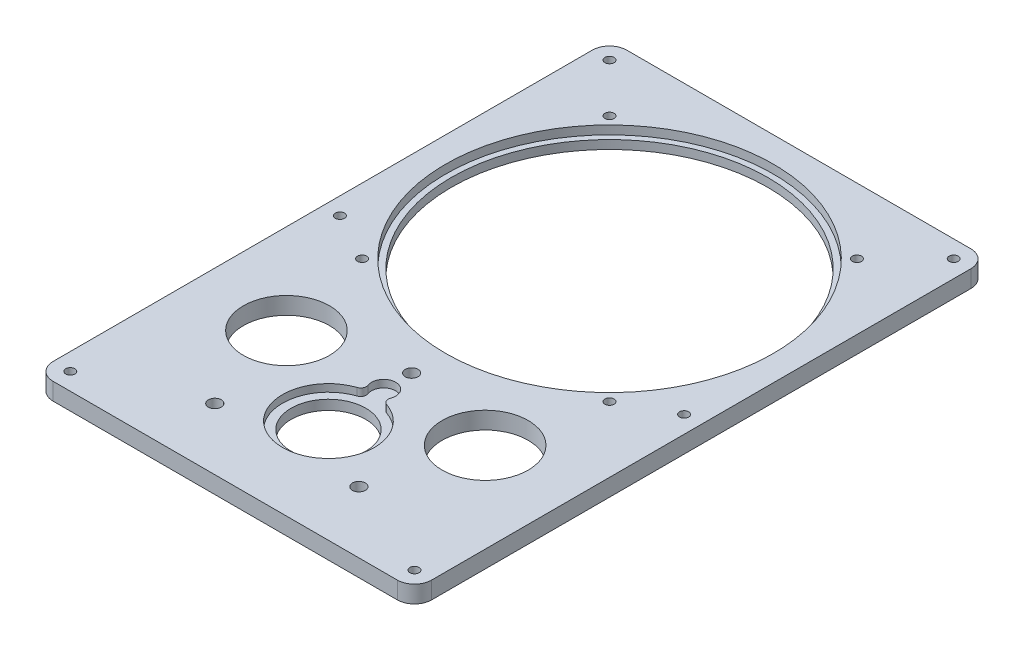
ISO-10303-21;
HEADER;
FILE_DESCRIPTION(('STEP AP214'),'2;1');
FILE_NAME('part.step','',(''),(''),'','','');
FILE_SCHEMA(('AUTOMOTIVE_DESIGN { 1 0 10303 214 1 1 1 1 }'));
ENDSEC;
DATA;
#1=APPLICATION_CONTEXT('core data for automotive mechanical design processes');
#2=APPLICATION_PROTOCOL_DEFINITION('international standard','automotive_design',2000,#1);
#3=PRODUCT_CONTEXT('',#1,'mechanical');
#4=PRODUCT('Part','Part','',(#3));
#5=PRODUCT_RELATED_PRODUCT_CATEGORY('part','',(#4));
#6=PRODUCT_DEFINITION_FORMATION('','',#4);
#7=PRODUCT_DEFINITION_CONTEXT('part definition',#1,'design');
#8=PRODUCT_DEFINITION('design','',#6,#7);
#9=PRODUCT_DEFINITION_SHAPE('','',#8);
#10=(LENGTH_UNIT() NAMED_UNIT(*) SI_UNIT(.MILLI.,.METRE.));
#11=(NAMED_UNIT(*) PLANE_ANGLE_UNIT() SI_UNIT($,.RADIAN.));
#12=(NAMED_UNIT(*) SI_UNIT($,.STERADIAN.) SOLID_ANGLE_UNIT());
#13=UNCERTAINTY_MEASURE_WITH_UNIT(LENGTH_MEASURE(1.E-05),#10,'distance_accuracy_value','');
#14=(GEOMETRIC_REPRESENTATION_CONTEXT(3) GLOBAL_UNCERTAINTY_ASSIGNED_CONTEXT((#13)) GLOBAL_UNIT_ASSIGNED_CONTEXT((#10,
#11,#12)) REPRESENTATION_CONTEXT('',''));
#15=CARTESIAN_POINT('',(0.,0.,0.));
#16=DIRECTION('',(0.,0.,1.));
#17=DIRECTION('',(1.,0.,0.));
#18=AXIS2_PLACEMENT_3D('',#15,#16,#17);
#19=CARTESIAN_POINT('',(0.,0.,64.));
#20=DIRECTION('',(0.,1.,0.));
#21=DIRECTION('',(0.,0.,1.));
#22=AXIS2_PLACEMENT_3D('',#19,#20,#21);
#23=CYLINDRICAL_SURFACE('',#22,13.);
#24=CARTESIAN_POINT('',(0.,0.,64.));
#25=DIRECTION('',(0.,1.,0.));
#26=DIRECTION('',(0.,0.,1.));
#27=AXIS2_PLACEMENT_3D('',#24,#25,#26);
#28=CIRCLE('',#27,13.);
#29=CARTESIAN_POINT('',(0.,0.,77.));
#30=VERTEX_POINT('',#29);
#31=EDGE_CURVE('E225',#30,#30,#28,.T.);
#32=ORIENTED_EDGE('',*,*,#31,.F.);
#33=EDGE_LOOP('',(#32));
#34=FACE_BOUND('',#33,.T.);
#35=CARTESIAN_POINT('',(0.,3.4,64.));
#36=DIRECTION('',(0.,1.,0.));
#37=DIRECTION('',(0.,0.,1.));
#38=AXIS2_PLACEMENT_3D('',#35,#36,#37);
#39=CIRCLE('',#38,13.);
#40=CARTESIAN_POINT('',(0.,3.4,77.));
#41=VERTEX_POINT('',#40);
#42=EDGE_CURVE('E150',#41,#41,#39,.F.);
#43=ORIENTED_EDGE('',*,*,#42,.F.);
#44=EDGE_LOOP('',(#43));
#45=FACE_BOUND('',#44,.T.);
#46=ADVANCED_FACE('F37',(#34,#45),#23,.F.);
#47=CARTESIAN_POINT('',(66.,6.,-100.));
#48=DIRECTION('',(-1.,0.,0.));
#49=DIRECTION('',(0.,0.,1.));
#50=AXIS2_PLACEMENT_3D('',#47,#48,#49);
#51=PLANE('',#50);
#52=DIRECTION('',(0.,0.,-1.));
#53=VECTOR('',#52,1.);
#54=CARTESIAN_POINT('',(66.,6.,-100.));
#55=LINE('',#54,#53);
#56=CARTESIAN_POINT('',(66.,6.,94.));
#57=VERTEX_POINT('',#56);
#58=CARTESIAN_POINT('',(66.,6.,-94.));
#59=VERTEX_POINT('',#58);
#60=EDGE_CURVE('E223',#57,#59,#55,.T.);
#61=ORIENTED_EDGE('',*,*,#60,.F.);
#62=DIRECTION('',(0.,-1.,0.));
#63=VECTOR('',#62,1.);
#64=CARTESIAN_POINT('',(66.,6.,94.));
#65=LINE('',#64,#63);
#66=CARTESIAN_POINT('',(66.,0.,94.));
#67=VERTEX_POINT('',#66);
#68=EDGE_CURVE('E169',#57,#67,#65,.T.);
#69=ORIENTED_EDGE('',*,*,#68,.T.);
#70=DIRECTION('',(0.,0.,-1.));
#71=VECTOR('',#70,1.);
#72=CARTESIAN_POINT('',(66.,0.,-100.));
#73=LINE('',#72,#71);
#74=CARTESIAN_POINT('',(66.,0.,-94.));
#75=VERTEX_POINT('',#74);
#76=EDGE_CURVE('E214',#67,#75,#73,.T.);
#77=ORIENTED_EDGE('',*,*,#76,.T.);
#78=DIRECTION('',(0.,-1.,0.));
#79=VECTOR('',#78,1.);
#80=CARTESIAN_POINT('',(66.,6.,-94.));
#81=LINE('',#80,#79);
#82=EDGE_CURVE('E167',#75,#59,#81,.F.);
#83=ORIENTED_EDGE('',*,*,#82,.T.);
#84=EDGE_LOOP('',(#61,#69,#77,#83));
#85=FACE_BOUND('',#84,.T.);
#86=ADVANCED_FACE('F285',(#85),#51,.F.);
#87=CARTESIAN_POINT('',(-66.,6.,-100.));
#88=DIRECTION('',(0.,0.,1.));
#89=DIRECTION('',(1.,0.,0.));
#90=AXIS2_PLACEMENT_3D('',#87,#88,#89);
#91=PLANE('',#90);
#92=DIRECTION('',(-1.,0.,0.));
#93=VECTOR('',#92,1.);
#94=CARTESIAN_POINT('',(-66.,6.,-100.));
#95=LINE('',#94,#93);
#96=CARTESIAN_POINT('',(60.,6.,-100.));
#97=VERTEX_POINT('',#96);
#98=CARTESIAN_POINT('',(-60.,6.,-100.));
#99=VERTEX_POINT('',#98);
#100=EDGE_CURVE('E204',#97,#99,#95,.T.);
#101=ORIENTED_EDGE('',*,*,#100,.F.);
#102=DIRECTION('',(0.,-1.,0.));
#103=VECTOR('',#102,1.);
#104=CARTESIAN_POINT('',(60.,6.,-100.));
#105=LINE('',#104,#103);
#106=CARTESIAN_POINT('',(60.,0.,-100.));
#107=VERTEX_POINT('',#106);
#108=EDGE_CURVE('E194',#97,#107,#105,.T.);
#109=ORIENTED_EDGE('',*,*,#108,.T.);
#110=DIRECTION('',(-1.,0.,0.));
#111=VECTOR('',#110,1.);
#112=CARTESIAN_POINT('',(-66.,0.,-100.));
#113=LINE('',#112,#111);
#114=CARTESIAN_POINT('',(-60.,0.,-100.));
#115=VERTEX_POINT('',#114);
#116=EDGE_CURVE('E202',#107,#115,#113,.T.);
#117=ORIENTED_EDGE('',*,*,#116,.T.);
#118=DIRECTION('',(0.,-1.,0.));
#119=VECTOR('',#118,1.);
#120=CARTESIAN_POINT('',(-60.,6.,-100.));
#121=LINE('',#120,#119);
#122=EDGE_CURVE('E192',#115,#99,#121,.F.);
#123=ORIENTED_EDGE('',*,*,#122,.T.);
#124=EDGE_LOOP('',(#101,#109,#117,#123));
#125=FACE_BOUND('',#124,.T.);
#126=ADVANCED_FACE('F201',(#125),#91,.F.);
#127=CARTESIAN_POINT('',(-66.,6.,-100.));
#128=DIRECTION('',(1.,0.,0.));
#129=DIRECTION('',(0.,0.,-1.));
#130=AXIS2_PLACEMENT_3D('',#127,#128,#129);
#131=PLANE('',#130);
#132=DIRECTION('',(0.,0.,1.));
#133=VECTOR('',#132,1.);
#134=CARTESIAN_POINT('',(-66.,6.,-100.));
#135=LINE('',#134,#133);
#136=CARTESIAN_POINT('',(-66.,6.,-94.));
#137=VERTEX_POINT('',#136);
#138=CARTESIAN_POINT('',(-66.,6.,94.));
#139=VERTEX_POINT('',#138);
#140=EDGE_CURVE('E271',#137,#139,#135,.T.);
#141=ORIENTED_EDGE('',*,*,#140,.F.);
#142=DIRECTION('',(0.,-1.,0.));
#143=VECTOR('',#142,1.);
#144=CARTESIAN_POINT('',(-66.,6.,-94.));
#145=LINE('',#144,#143);
#146=CARTESIAN_POINT('',(-66.,0.,-94.));
#147=VERTEX_POINT('',#146);
#148=EDGE_CURVE('E11',#137,#147,#145,.T.);
#149=ORIENTED_EDGE('',*,*,#148,.T.);
#150=DIRECTION('',(0.,0.,1.));
#151=VECTOR('',#150,1.);
#152=CARTESIAN_POINT('',(-66.,0.,-100.));
#153=LINE('',#152,#151);
#154=CARTESIAN_POINT('',(-66.,0.,94.));
#155=VERTEX_POINT('',#154);
#156=EDGE_CURVE('E213',#147,#155,#153,.T.);
#157=ORIENTED_EDGE('',*,*,#156,.T.);
#158=DIRECTION('',(0.,-1.,0.));
#159=VECTOR('',#158,1.);
#160=CARTESIAN_POINT('',(-66.,6.,94.));
#161=LINE('',#160,#159);
#162=EDGE_CURVE('E45',#155,#139,#161,.F.);
#163=ORIENTED_EDGE('',*,*,#162,.T.);
#164=EDGE_LOOP('',(#141,#149,#157,#163));
#165=FACE_BOUND('',#164,.T.);
#166=ADVANCED_FACE('F290',(#165),#131,.F.);
#167=CARTESIAN_POINT('',(-66.,6.,100.));
#168=DIRECTION('',(0.,0.,-1.));
#169=DIRECTION('',(-1.,0.,0.));
#170=AXIS2_PLACEMENT_3D('',#167,#168,#169);
#171=PLANE('',#170);
#172=DIRECTION('',(1.,0.,0.));
#173=VECTOR('',#172,1.);
#174=CARTESIAN_POINT('',(-66.,0.,100.));
#175=LINE('',#174,#173);
#176=CARTESIAN_POINT('',(-60.,0.,100.));
#177=VERTEX_POINT('',#176);
#178=CARTESIAN_POINT('',(60.,0.,100.));
#179=VERTEX_POINT('',#178);
#180=EDGE_CURVE('E216',#177,#179,#175,.T.);
#181=ORIENTED_EDGE('',*,*,#180,.T.);
#182=DIRECTION('',(0.,-1.,0.));
#183=VECTOR('',#182,1.);
#184=CARTESIAN_POINT('',(60.,6.,100.));
#185=LINE('',#184,#183);
#186=CARTESIAN_POINT('',(60.,6.,100.));
#187=VERTEX_POINT('',#186);
#188=EDGE_CURVE('E183',#179,#187,#185,.F.);
#189=ORIENTED_EDGE('',*,*,#188,.T.);
#190=DIRECTION('',(1.,0.,0.));
#191=VECTOR('',#190,1.);
#192=CARTESIAN_POINT('',(-66.,6.,100.));
#193=LINE('',#192,#191);
#194=CARTESIAN_POINT('',(-60.,6.,100.));
#195=VERTEX_POINT('',#194);
#196=EDGE_CURVE('E158',#195,#187,#193,.T.);
#197=ORIENTED_EDGE('',*,*,#196,.F.);
#198=DIRECTION('',(0.,-1.,0.));
#199=VECTOR('',#198,1.);
#200=CARTESIAN_POINT('',(-60.,6.,100.));
#201=LINE('',#200,#199);
#202=EDGE_CURVE('E180',#195,#177,#201,.T.);
#203=ORIENTED_EDGE('',*,*,#202,.T.);
#204=EDGE_LOOP('',(#181,#189,#197,#203));
#205=FACE_BOUND('',#204,.T.);
#206=ADVANCED_FACE('F288',(#205),#171,.F.);
#207=CARTESIAN_POINT('',(0.,6.,0.));
#208=DIRECTION('',(0.,1.,0.));
#209=DIRECTION('',(0.,0.,1.));
#210=AXIS2_PLACEMENT_3D('',#207,#208,#209);
#211=PLANE('',#210);
#212=CARTESIAN_POINT('',(34.6410161513779,6.,44.0000000000006));
#213=DIRECTION('',(0.,1.,0.));
#214=DIRECTION('',(0.,0.,1.));
#215=AXIS2_PLACEMENT_3D('',#212,#213,#214);
#216=CIRCLE('',#215,15.);
#217=CARTESIAN_POINT('',(34.6410161513779,6.,59.0000000000006));
#218=VERTEX_POINT('',#217);
#219=EDGE_CURVE('E438',#218,#218,#216,.T.);
#220=ORIENTED_EDGE('',*,*,#219,.F.);
#221=EDGE_LOOP('',(#220));
#222=FACE_BOUND('',#221,.T.);
#223=CARTESIAN_POINT('',(-34.6410161513779,6.,44.0000000000006));
#224=DIRECTION('',(0.,1.,0.));
#225=DIRECTION('',(0.,0.,-1.));
#226=AXIS2_PLACEMENT_3D('',#223,#224,#225);
#227=CIRCLE('',#226,15.);
#228=CARTESIAN_POINT('',(-34.6410161513779,6.,29.0000000000006));
#229=VERTEX_POINT('',#228);
#230=EDGE_CURVE('E432',#229,#229,#227,.T.);
#231=ORIENTED_EDGE('',*,*,#230,.F.);
#232=EDGE_LOOP('',(#231));
#233=FACE_BOUND('',#232,.T.);
#234=CARTESIAN_POINT('',(60.,6.,0.));
#235=DIRECTION('',(0.,1.,0.));
#236=DIRECTION('',(0.,0.,1.));
#237=AXIS2_PLACEMENT_3D('',#234,#235,#236);
#238=CIRCLE('',#237,1.6);
#239=CARTESIAN_POINT('',(60.,6.,1.6));
#240=VERTEX_POINT('',#239);
#241=EDGE_CURVE('E414',#240,#240,#238,.T.);
#242=ORIENTED_EDGE('',*,*,#241,.F.);
#243=EDGE_LOOP('',(#242));
#244=FACE_BOUND('',#243,.T.);
#245=CARTESIAN_POINT('',(-60.,6.,94.));
#246=DIRECTION('',(0.,1.,0.));
#247=DIRECTION('',(0.,0.,1.));
#248=AXIS2_PLACEMENT_3D('',#245,#246,#247);
#249=CIRCLE('',#248,1.6);
#250=CARTESIAN_POINT('',(-60.,6.,95.6));
#251=VERTEX_POINT('',#250);
#252=EDGE_CURVE('E421',#251,#251,#249,.T.);
#253=ORIENTED_EDGE('',*,*,#252,.F.);
#254=EDGE_LOOP('',(#253));
#255=FACE_BOUND('',#254,.T.);
#256=CARTESIAN_POINT('',(60.,6.,94.));
#257=DIRECTION('',(0.,1.,0.));
#258=DIRECTION('',(0.,0.,-1.));
#259=AXIS2_PLACEMENT_3D('',#256,#257,#258);
#260=CIRCLE('',#259,1.6);
#261=CARTESIAN_POINT('',(60.,6.,92.4));
#262=VERTEX_POINT('',#261);
#263=EDGE_CURVE('E402',#262,#262,#260,.T.);
#264=ORIENTED_EDGE('',*,*,#263,.F.);
#265=EDGE_LOOP('',(#264));
#266=FACE_BOUND('',#265,.T.);
#267=CARTESIAN_POINT('',(-60.,6.,-94.));
#268=DIRECTION('',(0.,1.,0.));
#269=DIRECTION('',(0.,0.,-1.));
#270=AXIS2_PLACEMENT_3D('',#267,#268,#269);
#271=CIRCLE('',#270,1.6);
#272=CARTESIAN_POINT('',(-60.,6.,-95.6));
#273=VERTEX_POINT('',#272);
#274=EDGE_CURVE('E409',#273,#273,#271,.T.);
#275=ORIENTED_EDGE('',*,*,#274,.F.);
#276=EDGE_LOOP('',(#275));
#277=FACE_BOUND('',#276,.T.);
#278=CARTESIAN_POINT('',(-60.,6.,0.));
#279=DIRECTION('',(0.,1.,0.));
#280=DIRECTION('',(0.,0.,-1.));
#281=AXIS2_PLACEMENT_3D('',#278,#279,#280);
#282=CIRCLE('',#281,1.59999999999998);
#283=CARTESIAN_POINT('',(-60.,6.,-1.59999999999997));
#284=VERTEX_POINT('',#283);
#285=EDGE_CURVE('E426',#284,#284,#282,.T.);
#286=ORIENTED_EDGE('',*,*,#285,.F.);
#287=EDGE_LOOP('',(#286));
#288=FACE_BOUND('',#287,.T.);
#289=CARTESIAN_POINT('',(60.,6.,-94.));
#290=DIRECTION('',(0.,1.,0.));
#291=DIRECTION('',(0.,0.,1.));
#292=AXIS2_PLACEMENT_3D('',#289,#290,#291);
#293=CIRCLE('',#292,1.6);
#294=CARTESIAN_POINT('',(60.,6.,-92.4));
#295=VERTEX_POINT('',#294);
#296=EDGE_CURVE('E396',#295,#295,#293,.T.);
#297=ORIENTED_EDGE('',*,*,#296,.F.);
#298=EDGE_LOOP('',(#297));
#299=FACE_BOUND('',#298,.T.);
#300=CARTESIAN_POINT('',(0.,6.,35.));
#301=DIRECTION('',(0.,1.,0.));
#302=DIRECTION('',(0.,0.,1.));
#303=AXIS2_PLACEMENT_3D('',#300,#301,#302);
#304=CIRCLE('',#303,2.25);
#305=CARTESIAN_POINT('',(0.,6.,37.25));
#306=VERTEX_POINT('',#305);
#307=EDGE_CURVE('E391',#306,#306,#304,.T.);
#308=ORIENTED_EDGE('',*,*,#307,.F.);
#309=EDGE_LOOP('',(#308));
#310=FACE_BOUND('',#309,.T.);
#311=CARTESIAN_POINT('',(25.1147367097493,6.,78.4999999999998));
#312=DIRECTION('',(0.,1.,0.));
#313=DIRECTION('',(0.,0.,1.));
#314=AXIS2_PLACEMENT_3D('',#311,#312,#313);
#315=CIRCLE('',#314,2.25);
#316=CARTESIAN_POINT('',(25.1147367097493,6.,80.7499999999998));
#317=VERTEX_POINT('',#316);
#318=EDGE_CURVE('E385',#317,#317,#315,.T.);
#319=ORIENTED_EDGE('',*,*,#318,.F.);
#320=EDGE_LOOP('',(#319));
#321=FACE_BOUND('',#320,.T.);
#322=CARTESIAN_POINT('',(-25.1147367097482,6.,78.5000000000001));
#323=DIRECTION('',(0.,1.,0.));
#324=DIRECTION('',(0.,0.,1.));
#325=AXIS2_PLACEMENT_3D('',#322,#323,#324);
#326=CIRCLE('',#325,2.25);
#327=CARTESIAN_POINT('',(-25.1147367097482,6.,80.7500000000001));
#328=VERTEX_POINT('',#327);
#329=EDGE_CURVE('E378',#328,#328,#326,.T.);
#330=ORIENTED_EDGE('',*,*,#329,.F.);
#331=EDGE_LOOP('',(#330));
#332=FACE_BOUND('',#331,.T.);
#333=CARTESIAN_POINT('',(0.,6.,64.));
#334=DIRECTION('',(0.,1.,0.));
#335=DIRECTION('',(0.,0.,1.));
#336=AXIS2_PLACEMENT_3D('',#333,#334,#335);
#337=CIRCLE('',#336,16.);
#338=CARTESIAN_POINT('',(-5.14983336366034,6.,48.8514285714286));
#339=VERTEX_POINT('',#338);
#340=CARTESIAN_POINT('',(5.14983336366037,6.,48.8514285714286));
#341=VERTEX_POINT('',#340);
#342=EDGE_CURVE('E151',#339,#341,#337,.T.);
#343=ORIENTED_EDGE('',*,*,#342,.F.);
#344=CARTESIAN_POINT('',(-5.79356253411788,6.,46.9578571428571));
#345=DIRECTION('',(0.,1.,0.));
#346=DIRECTION('',(0.,0.,1.));
#347=AXIS2_PLACEMENT_3D('',#344,#345,#346);
#348=CIRCLE('',#347,2.);
#349=CARTESIAN_POINT('',(-3.92467139407985,6.,46.2456451612903));
#350=VERTEX_POINT('',#349);
#351=EDGE_CURVE('E154',#339,#350,#348,.T.);
#352=ORIENTED_EDGE('',*,*,#351,.T.);
#353=CARTESIAN_POINT('',(0.,6.,44.75));
#354=DIRECTION('',(0.,1.,0.));
#355=DIRECTION('',(0.,0.,1.));
#356=AXIS2_PLACEMENT_3D('',#353,#354,#355);
#357=CIRCLE('',#356,4.2);
#358=CARTESIAN_POINT('',(3.92467139407989,6.,46.2456451612903));
#359=VERTEX_POINT('',#358);
#360=EDGE_CURVE('E373',#359,#350,#357,.T.);
#361=ORIENTED_EDGE('',*,*,#360,.F.);
#362=CARTESIAN_POINT('',(5.79356253411792,6.,46.9578571428571));
#363=DIRECTION('',(0.,1.,0.));
#364=DIRECTION('',(0.,0.,1.));
#365=AXIS2_PLACEMENT_3D('',#362,#363,#364);
#366=CIRCLE('',#365,2.);
#367=EDGE_CURVE('E155',#359,#341,#366,.T.);
#368=ORIENTED_EDGE('',*,*,#367,.T.);
#369=EDGE_LOOP('',(#343,#352,#361,#368));
#370=FACE_BOUND('',#369,.T.);
#371=CARTESIAN_POINT('',(43.1335136523789,6.,-77.1335136523799));
#372=DIRECTION('',(0.,1.,0.));
#373=DIRECTION('',(0.,0.,1.));
#374=AXIS2_PLACEMENT_3D('',#371,#372,#373);
#375=CIRCLE('',#374,1.6);
#376=CARTESIAN_POINT('',(43.1335136523789,6.,-75.5335136523799));
#377=VERTEX_POINT('',#376);
#378=EDGE_CURVE('E228',#377,#377,#375,.T.);
#379=ORIENTED_EDGE('',*,*,#378,.F.);
#380=EDGE_LOOP('',(#379));
#381=FACE_BOUND('',#380,.T.);
#382=CARTESIAN_POINT('',(-43.1335136523799,6.,-77.1335136523789));
#383=DIRECTION('',(0.,1.,0.));
#384=DIRECTION('',(0.,0.,1.));
#385=AXIS2_PLACEMENT_3D('',#382,#383,#384);
#386=CIRCLE('',#385,1.6);
#387=CARTESIAN_POINT('',(-43.1335136523799,6.,-75.5335136523789));
#388=VERTEX_POINT('',#387);
#389=EDGE_CURVE('E247',#388,#388,#386,.T.);
#390=ORIENTED_EDGE('',*,*,#389,.F.);
#391=EDGE_LOOP('',(#390));
#392=FACE_BOUND('',#391,.T.);
#393=CARTESIAN_POINT('',(-43.1335136523789,6.,9.13351365237994));
#394=DIRECTION('',(0.,1.,0.));
#395=DIRECTION('',(0.,0.,1.));
#396=AXIS2_PLACEMENT_3D('',#393,#394,#395);
#397=CIRCLE('',#396,1.6);
#398=CARTESIAN_POINT('',(-43.1335136523789,6.,10.7335136523799));
#399=VERTEX_POINT('',#398);
#400=EDGE_CURVE('E241',#399,#399,#397,.T.);
#401=ORIENTED_EDGE('',*,*,#400,.F.);
#402=EDGE_LOOP('',(#401));
#403=FACE_BOUND('',#402,.T.);
#404=CARTESIAN_POINT('',(43.1335136523799,6.,9.13351365237887));
#405=DIRECTION('',(0.,1.,0.));
#406=DIRECTION('',(0.,0.,1.));
#407=AXIS2_PLACEMENT_3D('',#404,#405,#406);
#408=CIRCLE('',#407,1.6);
#409=CARTESIAN_POINT('',(43.1335136523799,6.,10.7335136523789));
#410=VERTEX_POINT('',#409);
#411=EDGE_CURVE('E240',#410,#410,#408,.T.);
#412=ORIENTED_EDGE('',*,*,#411,.F.);
#413=EDGE_LOOP('',(#412));
#414=FACE_BOUND('',#413,.T.);
#415=CARTESIAN_POINT('',(0.,6.,-34.));
#416=DIRECTION('',(0.,1.,0.));
#417=DIRECTION('',(0.,0.,1.));
#418=AXIS2_PLACEMENT_3D('',#415,#416,#417);
#419=CIRCLE('',#418,57.15);
#420=CARTESIAN_POINT('',(0.,6.,23.15));
#421=VERTEX_POINT('',#420);
#422=EDGE_CURVE('E218',#421,#421,#419,.T.);
#423=ORIENTED_EDGE('',*,*,#422,.F.);
#424=EDGE_LOOP('',(#423));
#425=FACE_BOUND('',#424,.T.);
#426=ORIENTED_EDGE('',*,*,#196,.T.);
#427=CARTESIAN_POINT('',(60.,6.,94.));
#428=DIRECTION('',(0.,1.,0.));
#429=DIRECTION('',(0.,0.,1.));
#430=AXIS2_PLACEMENT_3D('',#427,#428,#429);
#431=CIRCLE('',#430,6.);
#432=EDGE_CURVE('E190',#187,#57,#431,.T.);
#433=ORIENTED_EDGE('',*,*,#432,.T.);
#434=ORIENTED_EDGE('',*,*,#60,.T.);
#435=CARTESIAN_POINT('',(60.,6.,-94.));
#436=DIRECTION('',(0.,1.,0.));
#437=DIRECTION('',(0.,0.,1.));
#438=AXIS2_PLACEMENT_3D('',#435,#436,#437);
#439=CIRCLE('',#438,6.);
#440=EDGE_CURVE('E188',#59,#97,#439,.T.);
#441=ORIENTED_EDGE('',*,*,#440,.T.);
#442=ORIENTED_EDGE('',*,*,#100,.T.);
#443=CARTESIAN_POINT('',(-60.,6.,-94.));
#444=DIRECTION('',(0.,1.,0.));
#445=DIRECTION('',(0.,0.,1.));
#446=AXIS2_PLACEMENT_3D('',#443,#444,#445);
#447=CIRCLE('',#446,6.);
#448=EDGE_CURVE('E58',#99,#137,#447,.T.);
#449=ORIENTED_EDGE('',*,*,#448,.T.);
#450=ORIENTED_EDGE('',*,*,#140,.T.);
#451=CARTESIAN_POINT('',(-60.,6.,94.));
#452=DIRECTION('',(0.,1.,0.));
#453=DIRECTION('',(0.,0.,1.));
#454=AXIS2_PLACEMENT_3D('',#451,#452,#453);
#455=CIRCLE('',#454,6.);
#456=EDGE_CURVE('E185',#139,#195,#455,.T.);
#457=ORIENTED_EDGE('',*,*,#456,.T.);
#458=EDGE_LOOP('',(#426,#433,#434,#441,#442,#449,#450,#457));
#459=FACE_BOUND('',#458,.T.);
#460=ADVANCED_FACE('F275',(#222,#233,#244,#255,#266,#277,#288,#299,#310,#321,#332,#370,#381,
#392,#403,#414,#425,#459),#211,.T.);
#461=CARTESIAN_POINT('',(0.,0.,0.));
#462=DIRECTION('',(0.,1.,0.));
#463=DIRECTION('',(0.,0.,1.));
#464=AXIS2_PLACEMENT_3D('',#461,#462,#463);
#465=PLANE('',#464);
#466=CARTESIAN_POINT('',(34.6410161513779,0.,44.0000000000006));
#467=DIRECTION('',(0.,1.,0.));
#468=DIRECTION('',(0.,0.,1.));
#469=AXIS2_PLACEMENT_3D('',#466,#467,#468);
#470=CIRCLE('',#469,15.);
#471=CARTESIAN_POINT('',(34.6410161513779,0.,59.0000000000006));
#472=VERTEX_POINT('',#471);
#473=EDGE_CURVE('E429',#472,#472,#470,.T.);
#474=ORIENTED_EDGE('',*,*,#473,.T.);
#475=EDGE_LOOP('',(#474));
#476=FACE_BOUND('',#475,.T.);
#477=CARTESIAN_POINT('',(-34.6410161513779,0.,44.0000000000006));
#478=DIRECTION('',(0.,1.,0.));
#479=DIRECTION('',(0.,0.,-1.));
#480=AXIS2_PLACEMENT_3D('',#477,#478,#479);
#481=CIRCLE('',#480,15.);
#482=CARTESIAN_POINT('',(-34.6410161513779,0.,29.0000000000006));
#483=VERTEX_POINT('',#482);
#484=EDGE_CURVE('E435',#483,#483,#481,.T.);
#485=ORIENTED_EDGE('',*,*,#484,.T.);
#486=EDGE_LOOP('',(#485));
#487=FACE_BOUND('',#486,.T.);
#488=CARTESIAN_POINT('',(60.,0.,0.));
#489=DIRECTION('',(0.,1.,0.));
#490=DIRECTION('',(0.,0.,1.));
#491=AXIS2_PLACEMENT_3D('',#488,#489,#490);
#492=CIRCLE('',#491,1.6);
#493=CARTESIAN_POINT('',(60.,0.,1.6));
#494=VERTEX_POINT('',#493);
#495=EDGE_CURVE('E417',#494,#494,#492,.T.);
#496=ORIENTED_EDGE('',*,*,#495,.T.);
#497=EDGE_LOOP('',(#496));
#498=FACE_BOUND('',#497,.T.);
#499=CARTESIAN_POINT('',(-60.,0.,94.));
#500=DIRECTION('',(0.,1.,0.));
#501=DIRECTION('',(0.,0.,1.));
#502=AXIS2_PLACEMENT_3D('',#499,#500,#501);
#503=CIRCLE('',#502,1.6);
#504=CARTESIAN_POINT('',(-60.,0.,95.6));
#505=VERTEX_POINT('',#504);
#506=EDGE_CURVE('E406',#505,#505,#503,.T.);
#507=ORIENTED_EDGE('',*,*,#506,.T.);
#508=EDGE_LOOP('',(#507));
#509=FACE_BOUND('',#508,.T.);
#510=CARTESIAN_POINT('',(60.,0.,94.));
#511=DIRECTION('',(0.,1.,0.));
#512=DIRECTION('',(0.,0.,-1.));
#513=AXIS2_PLACEMENT_3D('',#510,#511,#512);
#514=CIRCLE('',#513,1.6);
#515=CARTESIAN_POINT('',(60.,0.,92.4));
#516=VERTEX_POINT('',#515);
#517=EDGE_CURVE('E405',#516,#516,#514,.T.);
#518=ORIENTED_EDGE('',*,*,#517,.T.);
#519=EDGE_LOOP('',(#518));
#520=FACE_BOUND('',#519,.T.);
#521=CARTESIAN_POINT('',(-60.,0.,-94.));
#522=DIRECTION('',(0.,1.,0.));
#523=DIRECTION('',(0.,0.,-1.));
#524=AXIS2_PLACEMENT_3D('',#521,#522,#523);
#525=CIRCLE('',#524,1.6);
#526=CARTESIAN_POINT('',(-60.,0.,-95.6));
#527=VERTEX_POINT('',#526);
#528=EDGE_CURVE('E399',#527,#527,#525,.T.);
#529=ORIENTED_EDGE('',*,*,#528,.T.);
#530=EDGE_LOOP('',(#529));
#531=FACE_BOUND('',#530,.T.);
#532=CARTESIAN_POINT('',(-60.,0.,0.));
#533=DIRECTION('',(0.,1.,0.));
#534=DIRECTION('',(0.,0.,-1.));
#535=AXIS2_PLACEMENT_3D('',#532,#533,#534);
#536=CIRCLE('',#535,1.59999999999998);
#537=CARTESIAN_POINT('',(-60.,0.,-1.59999999999997));
#538=VERTEX_POINT('',#537);
#539=EDGE_CURVE('E418',#538,#538,#536,.T.);
#540=ORIENTED_EDGE('',*,*,#539,.T.);
#541=EDGE_LOOP('',(#540));
#542=FACE_BOUND('',#541,.T.);
#543=CARTESIAN_POINT('',(60.,0.,-94.));
#544=DIRECTION('',(0.,1.,0.));
#545=DIRECTION('',(0.,0.,1.));
#546=AXIS2_PLACEMENT_3D('',#543,#544,#545);
#547=CIRCLE('',#546,1.6);
#548=CARTESIAN_POINT('',(60.,0.,-92.4));
#549=VERTEX_POINT('',#548);
#550=EDGE_CURVE('E382',#549,#549,#547,.T.);
#551=ORIENTED_EDGE('',*,*,#550,.T.);
#552=EDGE_LOOP('',(#551));
#553=FACE_BOUND('',#552,.T.);
#554=CARTESIAN_POINT('',(0.,0.,35.));
#555=DIRECTION('',(0.,1.,0.));
#556=DIRECTION('',(0.,0.,1.));
#557=AXIS2_PLACEMENT_3D('',#554,#555,#556);
#558=CIRCLE('',#557,2.25);
#559=CARTESIAN_POINT('',(0.,0.,37.25));
#560=VERTEX_POINT('',#559);
#561=EDGE_CURVE('E375',#560,#560,#558,.T.);
#562=ORIENTED_EDGE('',*,*,#561,.T.);
#563=EDGE_LOOP('',(#562));
#564=FACE_BOUND('',#563,.T.);
#565=CARTESIAN_POINT('',(25.1147367097493,0.,78.4999999999998));
#566=DIRECTION('',(0.,1.,0.));
#567=DIRECTION('',(0.,0.,1.));
#568=AXIS2_PLACEMENT_3D('',#565,#566,#567);
#569=CIRCLE('',#568,2.25);
#570=CARTESIAN_POINT('',(25.1147367097493,0.,80.7499999999998));
#571=VERTEX_POINT('',#570);
#572=EDGE_CURVE('E388',#571,#571,#569,.T.);
#573=ORIENTED_EDGE('',*,*,#572,.T.);
#574=EDGE_LOOP('',(#573));
#575=FACE_BOUND('',#574,.T.);
#576=CARTESIAN_POINT('',(-25.1147367097482,0.,78.5000000000001));
#577=DIRECTION('',(0.,1.,0.));
#578=DIRECTION('',(0.,0.,1.));
#579=AXIS2_PLACEMENT_3D('',#576,#577,#578);
#580=CIRCLE('',#579,2.25);
#581=CARTESIAN_POINT('',(-25.1147367097482,0.,80.7500000000001));
#582=VERTEX_POINT('',#581);
#583=EDGE_CURVE('E381',#582,#582,#580,.T.);
#584=ORIENTED_EDGE('',*,*,#583,.T.);
#585=EDGE_LOOP('',(#584));
#586=FACE_BOUND('',#585,.T.);
#587=ORIENTED_EDGE('',*,*,#31,.T.);
#588=EDGE_LOOP('',(#587));
#589=FACE_BOUND('',#588,.T.);
#590=CARTESIAN_POINT('',(43.1335136523789,0.,-77.1335136523799));
#591=DIRECTION('',(0.,1.,0.));
#592=DIRECTION('',(0.,0.,1.));
#593=AXIS2_PLACEMENT_3D('',#590,#591,#592);
#594=CIRCLE('',#593,1.6);
#595=CARTESIAN_POINT('',(43.1335136523789,0.,-75.5335136523799));
#596=VERTEX_POINT('',#595);
#597=EDGE_CURVE('E233',#596,#596,#594,.T.);
#598=ORIENTED_EDGE('',*,*,#597,.T.);
#599=EDGE_LOOP('',(#598));
#600=FACE_BOUND('',#599,.T.);
#601=CARTESIAN_POINT('',(-43.1335136523799,0.,-77.1335136523789));
#602=DIRECTION('',(0.,1.,0.));
#603=DIRECTION('',(0.,0.,1.));
#604=AXIS2_PLACEMENT_3D('',#601,#602,#603);
#605=CIRCLE('',#604,1.6);
#606=CARTESIAN_POINT('',(-43.1335136523799,0.,-75.5335136523789));
#607=VERTEX_POINT('',#606);
#608=EDGE_CURVE('E244',#607,#607,#605,.T.);
#609=ORIENTED_EDGE('',*,*,#608,.T.);
#610=EDGE_LOOP('',(#609));
#611=FACE_BOUND('',#610,.T.);
#612=CARTESIAN_POINT('',(-43.1335136523789,0.,9.13351365237994));
#613=DIRECTION('',(0.,1.,0.));
#614=DIRECTION('',(0.,0.,1.));
#615=AXIS2_PLACEMENT_3D('',#612,#613,#614);
#616=CIRCLE('',#615,1.6);
#617=CARTESIAN_POINT('',(-43.1335136523789,0.,10.7335136523799));
#618=VERTEX_POINT('',#617);
#619=EDGE_CURVE('E237',#618,#618,#616,.T.);
#620=ORIENTED_EDGE('',*,*,#619,.T.);
#621=EDGE_LOOP('',(#620));
#622=FACE_BOUND('',#621,.T.);
#623=CARTESIAN_POINT('',(43.1335136523799,0.,9.13351365237887));
#624=DIRECTION('',(0.,1.,0.));
#625=DIRECTION('',(0.,0.,1.));
#626=AXIS2_PLACEMENT_3D('',#623,#624,#625);
#627=CIRCLE('',#626,1.6);
#628=CARTESIAN_POINT('',(43.1335136523799,0.,10.7335136523789));
#629=VERTEX_POINT('',#628);
#630=EDGE_CURVE('E252',#629,#629,#627,.T.);
#631=ORIENTED_EDGE('',*,*,#630,.T.);
#632=EDGE_LOOP('',(#631));
#633=FACE_BOUND('',#632,.T.);
#634=ORIENTED_EDGE('',*,*,#76,.F.);
#635=CARTESIAN_POINT('',(60.,0.,94.));
#636=DIRECTION('',(0.,1.,0.));
#637=DIRECTION('',(0.,0.,1.));
#638=AXIS2_PLACEMENT_3D('',#635,#636,#637);
#639=CIRCLE('',#638,6.);
#640=EDGE_CURVE('E178',#67,#179,#639,.F.);
#641=ORIENTED_EDGE('',*,*,#640,.T.);
#642=ORIENTED_EDGE('',*,*,#180,.F.);
#643=CARTESIAN_POINT('',(-60.,0.,94.));
#644=DIRECTION('',(0.,1.,0.));
#645=DIRECTION('',(0.,0.,1.));
#646=AXIS2_PLACEMENT_3D('',#643,#644,#645);
#647=CIRCLE('',#646,6.);
#648=EDGE_CURVE('E172',#177,#155,#647,.F.);
#649=ORIENTED_EDGE('',*,*,#648,.T.);
#650=ORIENTED_EDGE('',*,*,#156,.F.);
#651=CARTESIAN_POINT('',(-60.,0.,-94.));
#652=DIRECTION('',(0.,1.,0.));
#653=DIRECTION('',(0.,0.,1.));
#654=AXIS2_PLACEMENT_3D('',#651,#652,#653);
#655=CIRCLE('',#654,6.);
#656=EDGE_CURVE('E174',#147,#115,#655,.F.);
#657=ORIENTED_EDGE('',*,*,#656,.T.);
#658=ORIENTED_EDGE('',*,*,#116,.F.);
#659=CARTESIAN_POINT('',(60.,0.,-94.));
#660=DIRECTION('',(0.,1.,0.));
#661=DIRECTION('',(0.,0.,1.));
#662=AXIS2_PLACEMENT_3D('',#659,#660,#661);
#663=CIRCLE('',#662,6.);
#664=EDGE_CURVE('E176',#107,#75,#663,.F.);
#665=ORIENTED_EDGE('',*,*,#664,.T.);
#666=EDGE_LOOP('',(#634,#641,#642,#649,#650,#657,#658,#665));
#667=FACE_BOUND('',#666,.T.);
#668=CARTESIAN_POINT('',(0.,0.,-34.));
#669=DIRECTION('',(0.,1.,0.));
#670=DIRECTION('',(0.,0.,1.));
#671=AXIS2_PLACEMENT_3D('',#668,#669,#670);
#672=CIRCLE('',#671,55.15);
#673=CARTESIAN_POINT('',(0.,0.,21.15));
#674=VERTEX_POINT('',#673);
#675=EDGE_CURVE('E255',#674,#674,#672,.T.);
#676=ORIENTED_EDGE('',*,*,#675,.T.);
#677=EDGE_LOOP('',(#676));
#678=FACE_BOUND('',#677,.T.);
#679=ADVANCED_FACE('F209',(#476,#487,#498,#509,#520,#531,#542,#553,#564,#575,#586,#589,#600,
#611,#622,#633,#667,#678),#465,.F.);
#680=CARTESIAN_POINT('',(0.,0.,-34.));
#681=DIRECTION('',(0.,1.,0.));
#682=DIRECTION('',(0.,0.,1.));
#683=AXIS2_PLACEMENT_3D('',#680,#681,#682);
#684=CYLINDRICAL_SURFACE('',#683,57.15);
#685=CARTESIAN_POINT('',(0.,3.,-34.));
#686=DIRECTION('',(0.,1.,0.));
#687=DIRECTION('',(0.,0.,1.));
#688=AXIS2_PLACEMENT_3D('',#685,#686,#687);
#689=CIRCLE('',#688,57.15);
#690=CARTESIAN_POINT('',(0.,3.,23.15));
#691=VERTEX_POINT('',#690);
#692=EDGE_CURVE('E261',#691,#691,#689,.T.);
#693=ORIENTED_EDGE('',*,*,#692,.F.);
#694=EDGE_LOOP('',(#693));
#695=FACE_BOUND('',#694,.T.);
#696=ORIENTED_EDGE('',*,*,#422,.T.);
#697=EDGE_LOOP('',(#696));
#698=FACE_BOUND('',#697,.T.);
#699=ADVANCED_FACE('F337',(#695,#698),#684,.F.);
#700=CARTESIAN_POINT('',(0.,3.,-34.));
#701=DIRECTION('',(0.,1.,0.));
#702=DIRECTION('',(0.,0.,1.));
#703=AXIS2_PLACEMENT_3D('',#700,#701,#702);
#704=PLANE('',#703);
#705=ORIENTED_EDGE('',*,*,#692,.T.);
#706=EDGE_LOOP('',(#705));
#707=FACE_BOUND('',#706,.T.);
#708=CARTESIAN_POINT('',(0.,3.,-34.));
#709=DIRECTION('',(0.,1.,0.));
#710=DIRECTION('',(0.,0.,1.));
#711=AXIS2_PLACEMENT_3D('',#708,#709,#710);
#712=CIRCLE('',#711,55.15);
#713=CARTESIAN_POINT('',(0.,3.,21.15));
#714=VERTEX_POINT('',#713);
#715=EDGE_CURVE('E258',#714,#714,#712,.T.);
#716=ORIENTED_EDGE('',*,*,#715,.F.);
#717=EDGE_LOOP('',(#716));
#718=FACE_BOUND('',#717,.T.);
#719=ADVANCED_FACE('F333',(#707,#718),#704,.T.);
#720=CARTESIAN_POINT('',(0.,3.,-34.));
#721=DIRECTION('',(0.,-1.,0.));
#722=DIRECTION('',(0.,0.,-1.));
#723=AXIS2_PLACEMENT_3D('',#720,#721,#722);
#724=CYLINDRICAL_SURFACE('',#723,55.15);
#725=ORIENTED_EDGE('',*,*,#715,.T.);
#726=EDGE_LOOP('',(#725));
#727=FACE_BOUND('',#726,.T.);
#728=ORIENTED_EDGE('',*,*,#675,.F.);
#729=EDGE_LOOP('',(#728));
#730=FACE_BOUND('',#729,.T.);
#731=ADVANCED_FACE('F329',(#727,#730),#724,.F.);
#732=CARTESIAN_POINT('',(43.1335136523799,0.,9.13351365237887));
#733=DIRECTION('',(0.,1.,0.));
#734=DIRECTION('',(0.,0.,1.));
#735=AXIS2_PLACEMENT_3D('',#732,#733,#734);
#736=CYLINDRICAL_SURFACE('',#735,1.6);
#737=ORIENTED_EDGE('',*,*,#630,.F.);
#738=EDGE_LOOP('',(#737));
#739=FACE_BOUND('',#738,.T.);
#740=ORIENTED_EDGE('',*,*,#411,.T.);
#741=EDGE_LOOP('',(#740));
#742=FACE_BOUND('',#741,.T.);
#743=ADVANCED_FACE('F318',(#739,#742),#736,.F.);
#744=CARTESIAN_POINT('',(-43.1335136523789,0.,9.13351365237994));
#745=DIRECTION('',(0.,1.,0.));
#746=DIRECTION('',(0.,0.,1.));
#747=AXIS2_PLACEMENT_3D('',#744,#745,#746);
#748=CYLINDRICAL_SURFACE('',#747,1.6);
#749=ORIENTED_EDGE('',*,*,#619,.F.);
#750=EDGE_LOOP('',(#749));
#751=FACE_BOUND('',#750,.T.);
#752=ORIENTED_EDGE('',*,*,#400,.T.);
#753=EDGE_LOOP('',(#752));
#754=FACE_BOUND('',#753,.T.);
#755=ADVANCED_FACE('F314',(#751,#754),#748,.F.);
#756=CARTESIAN_POINT('',(-43.1335136523799,0.,-77.1335136523789));
#757=DIRECTION('',(0.,1.,0.));
#758=DIRECTION('',(0.,0.,1.));
#759=AXIS2_PLACEMENT_3D('',#756,#757,#758);
#760=CYLINDRICAL_SURFACE('',#759,1.6);
#761=ORIENTED_EDGE('',*,*,#608,.F.);
#762=EDGE_LOOP('',(#761));
#763=FACE_BOUND('',#762,.T.);
#764=ORIENTED_EDGE('',*,*,#389,.T.);
#765=EDGE_LOOP('',(#764));
#766=FACE_BOUND('',#765,.T.);
#767=ADVANCED_FACE('F317',(#763,#766),#760,.F.);
#768=CARTESIAN_POINT('',(43.1335136523789,0.,-77.1335136523799));
#769=DIRECTION('',(0.,1.,0.));
#770=DIRECTION('',(0.,0.,1.));
#771=AXIS2_PLACEMENT_3D('',#768,#769,#770);
#772=CYLINDRICAL_SURFACE('',#771,1.6);
#773=ORIENTED_EDGE('',*,*,#597,.F.);
#774=EDGE_LOOP('',(#773));
#775=FACE_BOUND('',#774,.T.);
#776=ORIENTED_EDGE('',*,*,#378,.T.);
#777=EDGE_LOOP('',(#776));
#778=FACE_BOUND('',#777,.T.);
#779=ADVANCED_FACE('F322',(#775,#778),#772,.F.);
#780=CARTESIAN_POINT('',(0.,3.4,64.));
#781=DIRECTION('',(0.,1.,0.));
#782=DIRECTION('',(0.,0.,1.));
#783=AXIS2_PLACEMENT_3D('',#780,#781,#782);
#784=PLANE('',#783);
#785=CARTESIAN_POINT('',(0.,3.4,44.75));
#786=DIRECTION('',(0.,1.,0.));
#787=DIRECTION('',(0.,0.,1.));
#788=AXIS2_PLACEMENT_3D('',#785,#786,#787);
#789=CIRCLE('',#788,4.2);
#790=CARTESIAN_POINT('',(3.92467139407989,3.4,46.2456451612903));
#791=VERTEX_POINT('',#790);
#792=CARTESIAN_POINT('',(-3.92467139407985,3.4,46.2456451612903));
#793=VERTEX_POINT('',#792);
#794=EDGE_CURVE('E134',#791,#793,#789,.T.);
#795=ORIENTED_EDGE('',*,*,#794,.T.);
#796=CARTESIAN_POINT('',(-5.79356253411788,3.4,46.9578571428571));
#797=DIRECTION('',(0.,1.,0.));
#798=DIRECTION('',(0.,0.,1.));
#799=AXIS2_PLACEMENT_3D('',#796,#797,#798);
#800=CIRCLE('',#799,2.);
#801=CARTESIAN_POINT('',(-5.14983336366034,3.4,48.8514285714286));
#802=VERTEX_POINT('',#801);
#803=EDGE_CURVE('E128',#793,#802,#800,.F.);
#804=ORIENTED_EDGE('',*,*,#803,.T.);
#805=CARTESIAN_POINT('',(0.,3.4,64.));
#806=DIRECTION('',(0.,1.,0.));
#807=DIRECTION('',(0.,0.,1.));
#808=AXIS2_PLACEMENT_3D('',#805,#806,#807);
#809=CIRCLE('',#808,16.);
#810=CARTESIAN_POINT('',(5.14983336366037,3.4,48.8514285714286));
#811=VERTEX_POINT('',#810);
#812=EDGE_CURVE('E132',#802,#811,#809,.T.);
#813=ORIENTED_EDGE('',*,*,#812,.T.);
#814=CARTESIAN_POINT('',(5.79356253411792,3.4,46.9578571428571));
#815=DIRECTION('',(0.,1.,0.));
#816=DIRECTION('',(0.,0.,1.));
#817=AXIS2_PLACEMENT_3D('',#814,#815,#816);
#818=CIRCLE('',#817,2.);
#819=EDGE_CURVE('E138',#811,#791,#818,.F.);
#820=ORIENTED_EDGE('',*,*,#819,.T.);
#821=EDGE_LOOP('',(#795,#804,#813,#820));
#822=FACE_BOUND('',#821,.T.);
#823=ORIENTED_EDGE('',*,*,#42,.T.);
#824=EDGE_LOOP('',(#823));
#825=FACE_BOUND('',#824,.T.);
#826=ADVANCED_FACE('F130',(#822,#825),#784,.T.);
#827=CARTESIAN_POINT('',(0.,3.4,64.));
#828=DIRECTION('',(0.,1.,0.));
#829=DIRECTION('',(0.,0.,1.));
#830=AXIS2_PLACEMENT_3D('',#827,#828,#829);
#831=CYLINDRICAL_SURFACE('',#830,16.);
#832=ORIENTED_EDGE('',*,*,#812,.F.);
#833=DIRECTION('',(0.,1.,0.));
#834=VECTOR('',#833,1.);
#835=CARTESIAN_POINT('',(-5.14983336366034,3.4,48.8514285714286));
#836=LINE('',#835,#834);
#837=EDGE_CURVE('E146',#802,#339,#836,.T.);
#838=ORIENTED_EDGE('',*,*,#837,.T.);
#839=ORIENTED_EDGE('',*,*,#342,.T.);
#840=DIRECTION('',(0.,1.,0.));
#841=VECTOR('',#840,1.);
#842=CARTESIAN_POINT('',(5.14983336366038,3.4,48.8514285714286));
#843=LINE('',#842,#841);
#844=EDGE_CURVE('E149',#341,#811,#843,.F.);
#845=ORIENTED_EDGE('',*,*,#844,.T.);
#846=EDGE_LOOP('',(#832,#838,#839,#845));
#847=FACE_BOUND('',#846,.T.);
#848=ADVANCED_FACE('F144',(#847),#831,.F.);
#849=CARTESIAN_POINT('',(0.,3.4,44.75));
#850=DIRECTION('',(0.,1.,0.));
#851=DIRECTION('',(0.,0.,1.));
#852=AXIS2_PLACEMENT_3D('',#849,#850,#851);
#853=CYLINDRICAL_SURFACE('',#852,4.2);
#854=ORIENTED_EDGE('',*,*,#360,.T.);
#855=DIRECTION('',(0.,1.,0.));
#856=VECTOR('',#855,1.);
#857=CARTESIAN_POINT('',(-3.92467139407986,3.4,46.2456451612903));
#858=LINE('',#857,#856);
#859=EDGE_CURVE('E139',#350,#793,#858,.F.);
#860=ORIENTED_EDGE('',*,*,#859,.T.);
#861=ORIENTED_EDGE('',*,*,#794,.F.);
#862=DIRECTION('',(0.,1.,0.));
#863=VECTOR('',#862,1.);
#864=CARTESIAN_POINT('',(3.92467139407989,3.4,46.2456451612903));
#865=LINE('',#864,#863);
#866=EDGE_CURVE('E163',#791,#359,#865,.T.);
#867=ORIENTED_EDGE('',*,*,#866,.T.);
#868=EDGE_LOOP('',(#854,#860,#861,#867));
#869=FACE_BOUND('',#868,.T.);
#870=ADVANCED_FACE('F357',(#869),#853,.F.);
#871=CARTESIAN_POINT('',(-5.79356253411788,3.4,46.9578571428571));
#872=DIRECTION('',(0.,1.,0.));
#873=DIRECTION('',(0.,0.,1.));
#874=AXIS2_PLACEMENT_3D('',#871,#872,#873);
#875=CYLINDRICAL_SURFACE('',#874,2.);
#876=ORIENTED_EDGE('',*,*,#803,.F.);
#877=ORIENTED_EDGE('',*,*,#859,.F.);
#878=ORIENTED_EDGE('',*,*,#351,.F.);
#879=ORIENTED_EDGE('',*,*,#837,.F.);
#880=EDGE_LOOP('',(#876,#877,#878,#879));
#881=FACE_BOUND('',#880,.T.);
#882=ADVANCED_FACE('F153',(#881),#875,.T.);
#883=CARTESIAN_POINT('',(5.79356253411792,3.4,46.9578571428571));
#884=DIRECTION('',(0.,-1.,0.));
#885=DIRECTION('',(0.,0.,-1.));
#886=AXIS2_PLACEMENT_3D('',#883,#884,#885);
#887=CYLINDRICAL_SURFACE('',#886,2.);
#888=ORIENTED_EDGE('',*,*,#367,.F.);
#889=ORIENTED_EDGE('',*,*,#866,.F.);
#890=ORIENTED_EDGE('',*,*,#819,.F.);
#891=ORIENTED_EDGE('',*,*,#844,.F.);
#892=EDGE_LOOP('',(#888,#889,#890,#891));
#893=FACE_BOUND('',#892,.T.);
#894=ADVANCED_FACE('F356',(#893),#887,.T.);
#895=CARTESIAN_POINT('',(-25.1147367097482,0.,78.5000000000001));
#896=DIRECTION('',(0.,1.,0.));
#897=DIRECTION('',(0.,0.,1.));
#898=AXIS2_PLACEMENT_3D('',#895,#896,#897);
#899=CYLINDRICAL_SURFACE('',#898,2.25);
#900=ORIENTED_EDGE('',*,*,#583,.F.);
#901=EDGE_LOOP('',(#900));
#902=FACE_BOUND('',#901,.T.);
#903=ORIENTED_EDGE('',*,*,#329,.T.);
#904=EDGE_LOOP('',(#903));
#905=FACE_BOUND('',#904,.T.);
#906=ADVANCED_FACE('F359',(#902,#905),#899,.F.);
#907=CARTESIAN_POINT('',(25.1147367097493,0.,78.4999999999998));
#908=DIRECTION('',(0.,1.,0.));
#909=DIRECTION('',(0.,0.,1.));
#910=AXIS2_PLACEMENT_3D('',#907,#908,#909);
#911=CYLINDRICAL_SURFACE('',#910,2.25);
#912=ORIENTED_EDGE('',*,*,#572,.F.);
#913=EDGE_LOOP('',(#912));
#914=FACE_BOUND('',#913,.T.);
#915=ORIENTED_EDGE('',*,*,#318,.T.);
#916=EDGE_LOOP('',(#915));
#917=FACE_BOUND('',#916,.T.);
#918=ADVANCED_FACE('F364',(#914,#917),#911,.F.);
#919=CARTESIAN_POINT('',(0.,0.,35.));
#920=DIRECTION('',(0.,1.,0.));
#921=DIRECTION('',(0.,0.,1.));
#922=AXIS2_PLACEMENT_3D('',#919,#920,#921);
#923=CYLINDRICAL_SURFACE('',#922,2.25);
#924=ORIENTED_EDGE('',*,*,#561,.F.);
#925=EDGE_LOOP('',(#924));
#926=FACE_BOUND('',#925,.T.);
#927=ORIENTED_EDGE('',*,*,#307,.T.);
#928=EDGE_LOOP('',(#927));
#929=FACE_BOUND('',#928,.T.);
#930=ADVANCED_FACE('F301',(#926,#929),#923,.F.);
#931=CARTESIAN_POINT('',(60.,6.,94.));
#932=DIRECTION('',(0.,-1.,0.));
#933=DIRECTION('',(0.,0.,-1.));
#934=AXIS2_PLACEMENT_3D('',#931,#932,#933);
#935=CYLINDRICAL_SURFACE('',#934,6.);
#936=ORIENTED_EDGE('',*,*,#432,.F.);
#937=ORIENTED_EDGE('',*,*,#188,.F.);
#938=ORIENTED_EDGE('',*,*,#640,.F.);
#939=ORIENTED_EDGE('',*,*,#68,.F.);
#940=EDGE_LOOP('',(#936,#937,#938,#939));
#941=FACE_BOUND('',#940,.T.);
#942=ADVANCED_FACE('F283',(#941),#935,.T.);
#943=CARTESIAN_POINT('',(60.,6.,-94.));
#944=DIRECTION('',(0.,-1.,0.));
#945=DIRECTION('',(0.,0.,-1.));
#946=AXIS2_PLACEMENT_3D('',#943,#944,#945);
#947=CYLINDRICAL_SURFACE('',#946,6.);
#948=ORIENTED_EDGE('',*,*,#440,.F.);
#949=ORIENTED_EDGE('',*,*,#82,.F.);
#950=ORIENTED_EDGE('',*,*,#664,.F.);
#951=ORIENTED_EDGE('',*,*,#108,.F.);
#952=EDGE_LOOP('',(#948,#949,#950,#951));
#953=FACE_BOUND('',#952,.T.);
#954=ADVANCED_FACE('F294',(#953),#947,.T.);
#955=CARTESIAN_POINT('',(-60.,6.,-94.));
#956=DIRECTION('',(0.,-1.,0.));
#957=DIRECTION('',(0.,0.,-1.));
#958=AXIS2_PLACEMENT_3D('',#955,#956,#957);
#959=CYLINDRICAL_SURFACE('',#958,6.);
#960=ORIENTED_EDGE('',*,*,#448,.F.);
#961=ORIENTED_EDGE('',*,*,#122,.F.);
#962=ORIENTED_EDGE('',*,*,#656,.F.);
#963=ORIENTED_EDGE('',*,*,#148,.F.);
#964=EDGE_LOOP('',(#960,#961,#962,#963));
#965=FACE_BOUND('',#964,.T.);
#966=ADVANCED_FACE('F293',(#965),#959,.T.);
#967=CARTESIAN_POINT('',(-60.,6.,94.));
#968=DIRECTION('',(0.,-1.,0.));
#969=DIRECTION('',(0.,0.,-1.));
#970=AXIS2_PLACEMENT_3D('',#967,#968,#969);
#971=CYLINDRICAL_SURFACE('',#970,6.);
#972=ORIENTED_EDGE('',*,*,#456,.F.);
#973=ORIENTED_EDGE('',*,*,#162,.F.);
#974=ORIENTED_EDGE('',*,*,#648,.F.);
#975=ORIENTED_EDGE('',*,*,#202,.F.);
#976=EDGE_LOOP('',(#972,#973,#974,#975));
#977=FACE_BOUND('',#976,.T.);
#978=ADVANCED_FACE('F39',(#977),#971,.T.);
#979=CARTESIAN_POINT('',(60.,0.,-94.));
#980=DIRECTION('',(0.,1.,0.));
#981=DIRECTION('',(0.,0.,1.));
#982=AXIS2_PLACEMENT_3D('',#979,#980,#981);
#983=CYLINDRICAL_SURFACE('',#982,1.6);
#984=ORIENTED_EDGE('',*,*,#550,.F.);
#985=EDGE_LOOP('',(#984));
#986=FACE_BOUND('',#985,.T.);
#987=ORIENTED_EDGE('',*,*,#296,.T.);
#988=EDGE_LOOP('',(#987));
#989=FACE_BOUND('',#988,.T.);
#990=ADVANCED_FACE('F570',(#986,#989),#983,.F.);
#991=CARTESIAN_POINT('',(-60.,0.,0.));
#992=DIRECTION('',(0.,1.,0.));
#993=DIRECTION('',(0.,0.,1.));
#994=AXIS2_PLACEMENT_3D('',#991,#992,#993);
#995=CYLINDRICAL_SURFACE('',#994,1.59999999999998);
#996=ORIENTED_EDGE('',*,*,#539,.F.);
#997=EDGE_LOOP('',(#996));
#998=FACE_BOUND('',#997,.T.);
#999=ORIENTED_EDGE('',*,*,#285,.T.);
#1000=EDGE_LOOP('',(#999));
#1001=FACE_BOUND('',#1000,.T.);
#1002=ADVANCED_FACE('F578',(#998,#1001),#995,.F.);
#1003=CARTESIAN_POINT('',(-60.,0.,-94.));
#1004=DIRECTION('',(0.,1.,0.));
#1005=DIRECTION('',(0.,0.,1.));
#1006=AXIS2_PLACEMENT_3D('',#1003,#1004,#1005);
#1007=CYLINDRICAL_SURFACE('',#1006,1.6);
#1008=ORIENTED_EDGE('',*,*,#528,.F.);
#1009=EDGE_LOOP('',(#1008));
#1010=FACE_BOUND('',#1009,.T.);
#1011=ORIENTED_EDGE('',*,*,#274,.T.);
#1012=EDGE_LOOP('',(#1011));
#1013=FACE_BOUND('',#1012,.T.);
#1014=ADVANCED_FACE('F587',(#1010,#1013),#1007,.F.);
#1015=CARTESIAN_POINT('',(60.,0.,94.));
#1016=DIRECTION('',(0.,1.,0.));
#1017=DIRECTION('',(0.,0.,1.));
#1018=AXIS2_PLACEMENT_3D('',#1015,#1016,#1017);
#1019=CYLINDRICAL_SURFACE('',#1018,1.6);
#1020=ORIENTED_EDGE('',*,*,#517,.F.);
#1021=EDGE_LOOP('',(#1020));
#1022=FACE_BOUND('',#1021,.T.);
#1023=ORIENTED_EDGE('',*,*,#263,.T.);
#1024=EDGE_LOOP('',(#1023));
#1025=FACE_BOUND('',#1024,.T.);
#1026=ADVANCED_FACE('F597',(#1022,#1025),#1019,.F.);
#1027=CARTESIAN_POINT('',(-60.,0.,94.));
#1028=DIRECTION('',(0.,1.,0.));
#1029=DIRECTION('',(0.,0.,1.));
#1030=AXIS2_PLACEMENT_3D('',#1027,#1028,#1029);
#1031=CYLINDRICAL_SURFACE('',#1030,1.6);
#1032=ORIENTED_EDGE('',*,*,#506,.F.);
#1033=EDGE_LOOP('',(#1032));
#1034=FACE_BOUND('',#1033,.T.);
#1035=ORIENTED_EDGE('',*,*,#252,.T.);
#1036=EDGE_LOOP('',(#1035));
#1037=FACE_BOUND('',#1036,.T.);
#1038=ADVANCED_FACE('F607',(#1034,#1037),#1031,.F.);
#1039=CARTESIAN_POINT('',(60.,0.,0.));
#1040=DIRECTION('',(0.,1.,0.));
#1041=DIRECTION('',(0.,0.,1.));
#1042=AXIS2_PLACEMENT_3D('',#1039,#1040,#1041);
#1043=CYLINDRICAL_SURFACE('',#1042,1.6);
#1044=ORIENTED_EDGE('',*,*,#495,.F.);
#1045=EDGE_LOOP('',(#1044));
#1046=FACE_BOUND('',#1045,.T.);
#1047=ORIENTED_EDGE('',*,*,#241,.T.);
#1048=EDGE_LOOP('',(#1047));
#1049=FACE_BOUND('',#1048,.T.);
#1050=ADVANCED_FACE('F617',(#1046,#1049),#1043,.F.);
#1051=CARTESIAN_POINT('',(-34.6410161513779,0.,44.0000000000006));
#1052=DIRECTION('',(0.,1.,0.));
#1053=DIRECTION('',(0.,0.,1.));
#1054=AXIS2_PLACEMENT_3D('',#1051,#1052,#1053);
#1055=CYLINDRICAL_SURFACE('',#1054,15.);
#1056=ORIENTED_EDGE('',*,*,#484,.F.);
#1057=EDGE_LOOP('',(#1056));
#1058=FACE_BOUND('',#1057,.T.);
#1059=ORIENTED_EDGE('',*,*,#230,.T.);
#1060=EDGE_LOOP('',(#1059));
#1061=FACE_BOUND('',#1060,.T.);
#1062=ADVANCED_FACE('F448',(#1058,#1061),#1055,.F.);
#1063=CARTESIAN_POINT('',(34.6410161513779,0.,44.0000000000006));
#1064=DIRECTION('',(0.,1.,0.));
#1065=DIRECTION('',(0.,0.,1.));
#1066=AXIS2_PLACEMENT_3D('',#1063,#1064,#1065);
#1067=CYLINDRICAL_SURFACE('',#1066,15.);
#1068=ORIENTED_EDGE('',*,*,#473,.F.);
#1069=EDGE_LOOP('',(#1068));
#1070=FACE_BOUND('',#1069,.T.);
#1071=ORIENTED_EDGE('',*,*,#219,.T.);
#1072=EDGE_LOOP('',(#1071));
#1073=FACE_BOUND('',#1072,.T.);
#1074=ADVANCED_FACE('F445',(#1070,#1073),#1067,.F.);
#1075=CLOSED_SHELL('',(#46,#86,#126,#166,#206,#460,#679,#699,#719,#731,#743,#755,#767,#779,#826,
#848,#870,#882,#894,#906,#918,#930,#942,#954,#966,#978,#990,#1002,#1014,#1026,#1038,#1050,#1062,#1074));
#1076=MANIFOLD_SOLID_BREP('B2',#1075);
#1077=ADVANCED_BREP_SHAPE_REPRESENTATION('',(#18,#1076),#14);
#1078=SHAPE_DEFINITION_REPRESENTATION(#9,#1077);
ENDSEC;
END-ISO-10303-21;
